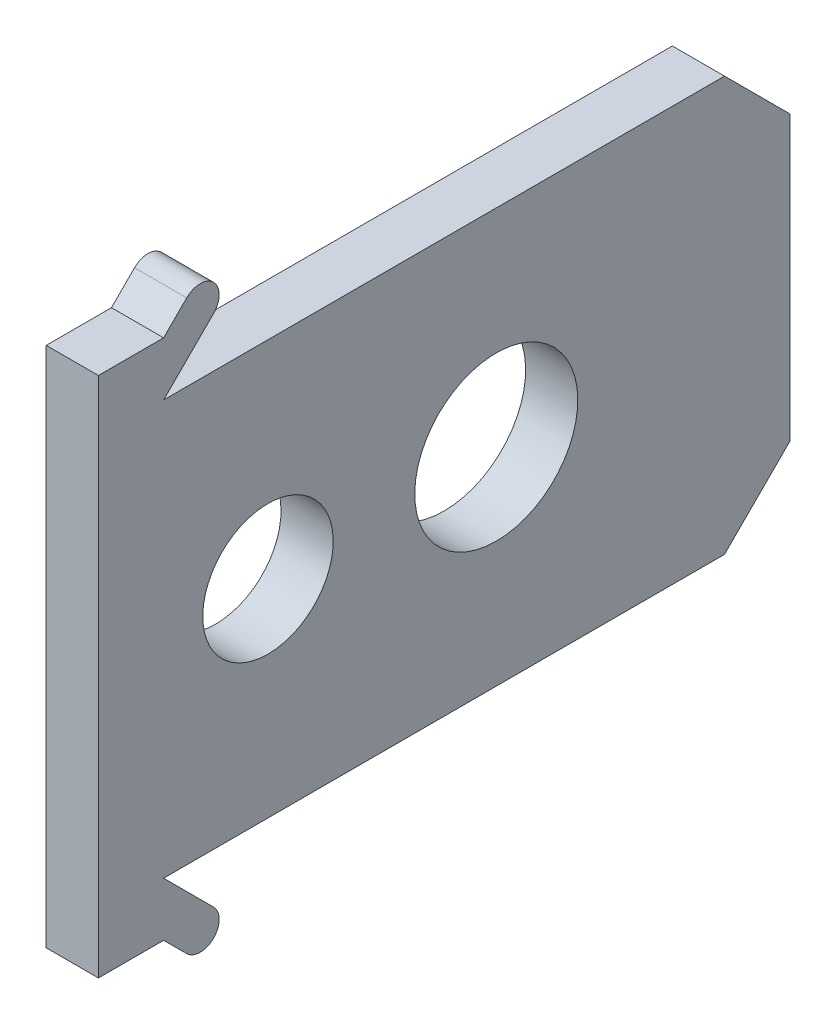
ISO-10303-21;
HEADER;
FILE_DESCRIPTION(('STEP AP214'),'2;1');
FILE_NAME('part.step','',(''),(''),'','','');
FILE_SCHEMA(('AUTOMOTIVE_DESIGN { 1 0 10303 214 1 1 1 1 }'));
ENDSEC;
DATA;
#1=APPLICATION_CONTEXT('core data for automotive mechanical design processes');
#2=APPLICATION_PROTOCOL_DEFINITION('international standard','automotive_design',2000,#1);
#3=PRODUCT_CONTEXT('',#1,'mechanical');
#4=PRODUCT('Part','Part','',(#3));
#5=PRODUCT_RELATED_PRODUCT_CATEGORY('part','',(#4));
#6=PRODUCT_DEFINITION_FORMATION('','',#4);
#7=PRODUCT_DEFINITION_CONTEXT('part definition',#1,'design');
#8=PRODUCT_DEFINITION('design','',#6,#7);
#9=PRODUCT_DEFINITION_SHAPE('','',#8);
#10=(LENGTH_UNIT() NAMED_UNIT(*) SI_UNIT(.MILLI.,.METRE.));
#11=(NAMED_UNIT(*) PLANE_ANGLE_UNIT() SI_UNIT($,.RADIAN.));
#12=(NAMED_UNIT(*) SI_UNIT($,.STERADIAN.) SOLID_ANGLE_UNIT());
#13=UNCERTAINTY_MEASURE_WITH_UNIT(LENGTH_MEASURE(1.E-05),#10,'distance_accuracy_value','');
#14=(GEOMETRIC_REPRESENTATION_CONTEXT(3) GLOBAL_UNCERTAINTY_ASSIGNED_CONTEXT((#13)) GLOBAL_UNIT_ASSIGNED_CONTEXT((#10,
#11,#12)) REPRESENTATION_CONTEXT('',''));
#15=CARTESIAN_POINT('',(0.,0.,0.));
#16=DIRECTION('',(0.,0.,1.));
#17=DIRECTION('',(1.,0.,0.));
#18=AXIS2_PLACEMENT_3D('',#15,#16,#17);
#19=CARTESIAN_POINT('',(0.,0.,-5.1));
#20=DIRECTION('',(1.,0.,0.));
#21=DIRECTION('',(0.,-1.,0.));
#22=AXIS2_PLACEMENT_3D('',#19,#20,#21);
#23=CYLINDRICAL_SURFACE('',#22,1.25);
#24=CARTESIAN_POINT('',(-0.40000000001,0.,-5.10000000001));
#25=DIRECTION('',(1.,0.,0.));
#26=DIRECTION('',(0.,-1.,0.));
#27=AXIS2_PLACEMENT_3D('',#24,#25,#26);
#28=CIRCLE('',#27,1.25000000001);
#29=CARTESIAN_POINT('',(-0.40000000001,-1.25000000001,-5.10000000001));
#30=VERTEX_POINT('',#29);
#31=EDGE_CURVE('E11',#30,#30,#28,.T.);
#32=ORIENTED_EDGE('',*,*,#31,.F.);
#33=EDGE_LOOP('',(#32));
#34=FACE_BOUND('',#33,.T.);
#35=CARTESIAN_POINT('',(0.40000000001,0.,-5.10000000001));
#36=DIRECTION('',(-1.,0.,0.));
#37=DIRECTION('',(0.,-1.,0.));
#38=AXIS2_PLACEMENT_3D('',#35,#36,#37);
#39=CIRCLE('',#38,1.25000000001);
#40=CARTESIAN_POINT('',(0.40000000001,-1.25000000001,-5.10000000001));
#41=VERTEX_POINT('',#40);
#42=EDGE_CURVE('E268',#41,#41,#39,.T.);
#43=ORIENTED_EDGE('',*,*,#42,.F.);
#44=EDGE_LOOP('',(#43));
#45=FACE_BOUND('',#44,.T.);
#46=ADVANCED_FACE('F17',(#34,#45),#23,.F.);
#47=CARTESIAN_POINT('',(0.,0.,-1.6));
#48=DIRECTION('',(1.,0.,0.));
#49=DIRECTION('',(0.,-1.,0.));
#50=AXIS2_PLACEMENT_3D('',#47,#48,#49);
#51=CYLINDRICAL_SURFACE('',#50,1.);
#52=CARTESIAN_POINT('',(-0.40000000001,1.E-11,-1.60000000001));
#53=DIRECTION('',(1.,0.,0.));
#54=DIRECTION('',(0.,-1.,0.));
#55=AXIS2_PLACEMENT_3D('',#52,#53,#54);
#56=CIRCLE('',#55,1.00000000001);
#57=CARTESIAN_POINT('',(-0.40000000001,-1.,-1.60000000001));
#58=VERTEX_POINT('',#57);
#59=EDGE_CURVE('E28',#58,#58,#56,.T.);
#60=ORIENTED_EDGE('',*,*,#59,.F.);
#61=EDGE_LOOP('',(#60));
#62=FACE_BOUND('',#61,.T.);
#63=CARTESIAN_POINT('',(0.40000000001,1.E-11,-1.60000000001));
#64=DIRECTION('',(-1.,0.,0.));
#65=DIRECTION('',(0.,-1.,0.));
#66=AXIS2_PLACEMENT_3D('',#63,#64,#65);
#67=CIRCLE('',#66,1.00000000001);
#68=CARTESIAN_POINT('',(0.40000000001,-1.,-1.60000000001));
#69=VERTEX_POINT('',#68);
#70=EDGE_CURVE('E272',#69,#69,#67,.T.);
#71=ORIENTED_EDGE('',*,*,#70,.F.);
#72=EDGE_LOOP('',(#71));
#73=FACE_BOUND('',#72,.T.);
#74=ADVANCED_FACE('F614',(#62,#73),#51,.F.);
#75=CARTESIAN_POINT('',(-0.4,0.,-3.42091576003781));
#76=DIRECTION('',(1.,0.,0.));
#77=DIRECTION('',(0.,1.,0.));
#78=AXIS2_PLACEMENT_3D('',#75,#76,#77);
#79=PLANE('',#78);
#80=DIRECTION('',(0.,0.,-1.));
#81=VECTOR('',#80,1.);
#82=CARTESIAN_POINT('',(-0.40000000001,-4.00000000001,1.00000000001));
#83=LINE('',#82,#81);
#84=CARTESIAN_POINT('',(-0.4,-4.,1.));
#85=VERTEX_POINT('',#84);
#86=CARTESIAN_POINT('',(-0.4,-4.,0.));
#87=VERTEX_POINT('',#86);
#88=EDGE_CURVE('E244',#85,#87,#83,.T.);
#89=ORIENTED_EDGE('',*,*,#88,.F.);
#90=DIRECTION('',(0.,-1.,0.));
#91=VECTOR('',#90,1.);
#92=CARTESIAN_POINT('',(-0.40000000001,4.00000000001,1.00000000001));
#93=LINE('',#92,#91);
#94=CARTESIAN_POINT('',(-0.4,4.,1.));
#95=VERTEX_POINT('',#94);
#96=EDGE_CURVE('E43',#95,#85,#93,.T.);
#97=ORIENTED_EDGE('',*,*,#96,.F.);
#98=DIRECTION('',(0.,0.,1.));
#99=VECTOR('',#98,1.);
#100=CARTESIAN_POINT('',(-0.40000000001,4.00000000001,0.));
#101=LINE('',#100,#99);
#102=CARTESIAN_POINT('',(-0.4,4.,0.));
#103=VERTEX_POINT('',#102);
#104=EDGE_CURVE('E253',#103,#95,#101,.T.);
#105=ORIENTED_EDGE('',*,*,#104,.F.);
#106=DIRECTION('',(0.,-0.707106781186546,0.70710678118655));
#107=VECTOR('',#106,1.);
#108=CARTESIAN_POINT('',(-0.40000000001,4.35355339060327,-0.353553390603275));
#109=LINE('',#108,#107);
#110=CARTESIAN_POINT('',(-0.4,4.35355339059327,-0.353553390593275));
#111=VERTEX_POINT('',#110);
#112=EDGE_CURVE('E285',#111,#103,#109,.T.);
#113=ORIENTED_EDGE('',*,*,#112,.F.);
#114=CARTESIAN_POINT('',(-0.40000000001,4.14730339060327,-0.559803390603273));
#115=DIRECTION('',(1.,0.,0.));
#116=DIRECTION('',(0.,0.707106781186547,0.707106781186548));
#117=AXIS2_PLACEMENT_3D('',#114,#115,#116);
#118=CIRCLE('',#117,0.291681547253593);
#119=CARTESIAN_POINT('',(-0.4,3.94105339059327,-0.766053390593274));
#120=VERTEX_POINT('',#119);
#121=EDGE_CURVE('E116',#120,#111,#118,.T.);
#122=ORIENTED_EDGE('',*,*,#121,.F.);
#123=DIRECTION('',(0.,0.707106781186547,-0.707106781186548));
#124=VECTOR('',#123,1.);
#125=CARTESIAN_POINT('',(-0.40000000001,3.17500000001,-1.0001665335E-11));
#126=LINE('',#125,#124);
#127=CARTESIAN_POINT('',(-0.4,3.175,0.));
#128=VERTEX_POINT('',#127);
#129=EDGE_CURVE('E129',#128,#120,#126,.T.);
#130=ORIENTED_EDGE('',*,*,#129,.F.);
#131=DIRECTION('',(0.,0.,1.));
#132=VECTOR('',#131,1.);
#133=CARTESIAN_POINT('',(-0.40000000001,3.17500000001,-8.60000000001));
#134=LINE('',#133,#132);
#135=CARTESIAN_POINT('',(-0.4,3.175,-8.6));
#136=VERTEX_POINT('',#135);
#137=EDGE_CURVE('E207',#136,#128,#134,.T.);
#138=ORIENTED_EDGE('',*,*,#137,.F.);
#139=DIRECTION('',(0.,0.707106781186548,0.707106781186548));
#140=VECTOR('',#139,1.);
#141=CARTESIAN_POINT('',(-0.40000000001,2.17500000001,-9.60000000001));
#142=LINE('',#141,#140);
#143=CARTESIAN_POINT('',(-0.4,2.175,-9.6));
#144=VERTEX_POINT('',#143);
#145=EDGE_CURVE('E201',#144,#136,#142,.T.);
#146=ORIENTED_EDGE('',*,*,#145,.F.);
#147=DIRECTION('',(0.,1.,0.));
#148=VECTOR('',#147,1.);
#149=CARTESIAN_POINT('',(-0.40000000001,-2.17500000001,-9.60000000001));
#150=LINE('',#149,#148);
#151=CARTESIAN_POINT('',(-0.4,-2.175,-9.6));
#152=VERTEX_POINT('',#151);
#153=EDGE_CURVE('E198',#152,#144,#150,.T.);
#154=ORIENTED_EDGE('',*,*,#153,.F.);
#155=DIRECTION('',(0.,0.707106781186547,-0.707106781186548));
#156=VECTOR('',#155,1.);
#157=CARTESIAN_POINT('',(-0.40000000001,-3.17500000001,-8.60000000001));
#158=LINE('',#157,#156);
#159=CARTESIAN_POINT('',(-0.4,-3.175,-8.6));
#160=VERTEX_POINT('',#159);
#161=EDGE_CURVE('E158',#160,#152,#158,.T.);
#162=ORIENTED_EDGE('',*,*,#161,.F.);
#163=DIRECTION('',(0.,0.,-1.));
#164=VECTOR('',#163,1.);
#165=CARTESIAN_POINT('',(-0.40000000001,-3.17500000001,-1.0001387779E-11));
#166=LINE('',#165,#164);
#167=CARTESIAN_POINT('',(-0.4,-3.175,0.));
#168=VERTEX_POINT('',#167);
#169=EDGE_CURVE('E168',#168,#160,#166,.T.);
#170=ORIENTED_EDGE('',*,*,#169,.F.);
#171=DIRECTION('',(0.,0.707106781186548,0.707106781186548));
#172=VECTOR('',#171,1.);
#173=CARTESIAN_POINT('',(-0.40000000001,-3.94105339060328,-0.766053390603274));
#174=LINE('',#173,#172);
#175=CARTESIAN_POINT('',(-0.4,-3.94105339059328,-0.766053390593274));
#176=VERTEX_POINT('',#175);
#177=EDGE_CURVE('E234',#176,#168,#174,.T.);
#178=ORIENTED_EDGE('',*,*,#177,.F.);
#179=CARTESIAN_POINT('',(-0.40000000001,-4.14730339060328,-0.559803390603274));
#180=DIRECTION('',(1.,0.,0.));
#181=DIRECTION('',(0.,0.707106781186548,-0.707106781186547));
#182=AXIS2_PLACEMENT_3D('',#179,#180,#181);
#183=CIRCLE('',#182,0.291681547253593);
#184=CARTESIAN_POINT('',(-0.4,-4.35355339059327,-0.353553390593275));
#185=VERTEX_POINT('',#184);
#186=EDGE_CURVE('E267',#185,#176,#183,.T.);
#187=ORIENTED_EDGE('',*,*,#186,.F.);
#188=DIRECTION('',(0.,-0.707106781186546,-0.707106781186549));
#189=VECTOR('',#188,1.);
#190=CARTESIAN_POINT('',(-0.40000000001,-4.00000000001,-1.00004601036E-11));
#191=LINE('',#190,#189);
#192=EDGE_CURVE('E236',#87,#185,#191,.T.);
#193=ORIENTED_EDGE('',*,*,#192,.F.);
#194=EDGE_LOOP('',(#89,#97,#105,#113,#122,#130,#138,#146,#154,#162,#170,#178,#187,#193));
#195=FACE_BOUND('',#194,.T.);
#196=ORIENTED_EDGE('',*,*,#31,.T.);
#197=EDGE_LOOP('',(#196));
#198=FACE_BOUND('',#197,.T.);
#199=ORIENTED_EDGE('',*,*,#59,.T.);
#200=EDGE_LOOP('',(#199));
#201=FACE_BOUND('',#200,.T.);
#202=ADVANCED_FACE('F337',(#195,#198,#201),#79,.F.);
#203=CARTESIAN_POINT('',(0.,4.,1.));
#204=DIRECTION('',(0.,1.,0.));
#205=DIRECTION('',(1.,0.,0.));
#206=AXIS2_PLACEMENT_3D('',#203,#204,#205);
#207=PLANE('',#206);
#208=DIRECTION('',(0.,0.,-1.));
#209=VECTOR('',#208,1.);
#210=CARTESIAN_POINT('',(0.40000000001,4.00000000001,1.00000000001));
#211=LINE('',#210,#209);
#212=CARTESIAN_POINT('',(0.4,4.,1.));
#213=VERTEX_POINT('',#212);
#214=CARTESIAN_POINT('',(0.4,4.,0.));
#215=VERTEX_POINT('',#214);
#216=EDGE_CURVE('E247',#213,#215,#211,.T.);
#217=ORIENTED_EDGE('',*,*,#216,.T.);
#218=DIRECTION('',(-1.,0.,0.));
#219=VECTOR('',#218,1.);
#220=CARTESIAN_POINT('',(0.40000000001,4.00000000001,0.));
#221=LINE('',#220,#219);
#222=EDGE_CURVE('E249',#215,#103,#221,.T.);
#223=ORIENTED_EDGE('',*,*,#222,.T.);
#224=ORIENTED_EDGE('',*,*,#104,.T.);
#225=DIRECTION('',(-1.,0.,0.));
#226=VECTOR('',#225,1.);
#227=CARTESIAN_POINT('',(0.40000000001,4.00000000001,1.00000000001));
#228=LINE('',#227,#226);
#229=EDGE_CURVE('E258',#213,#95,#228,.T.);
#230=ORIENTED_EDGE('',*,*,#229,.F.);
#231=EDGE_LOOP('',(#217,#223,#224,#230));
#232=FACE_BOUND('',#231,.T.);
#233=ADVANCED_FACE('F398',(#232),#207,.T.);
#234=CARTESIAN_POINT('',(0.,4.,0.));
#235=DIRECTION('',(0.,0.707106781186549,0.707106781186546));
#236=DIRECTION('',(1.,0.,0.));
#237=AXIS2_PLACEMENT_3D('',#234,#235,#236);
#238=PLANE('',#237);
#239=DIRECTION('',(0.,0.707106781186546,-0.70710678118655));
#240=VECTOR('',#239,1.);
#241=CARTESIAN_POINT('',(0.40000000001,4.00000000001,0.));
#242=LINE('',#241,#240);
#243=CARTESIAN_POINT('',(0.4,4.35355339059327,-0.353553390593275));
#244=VERTEX_POINT('',#243);
#245=EDGE_CURVE('E279',#215,#244,#242,.T.);
#246=ORIENTED_EDGE('',*,*,#245,.T.);
#247=DIRECTION('',(-1.,0.,0.));
#248=VECTOR('',#247,1.);
#249=CARTESIAN_POINT('',(0.40000000001,4.35355339060327,-0.353553390603275));
#250=LINE('',#249,#248);
#251=EDGE_CURVE('E281',#244,#111,#250,.T.);
#252=ORIENTED_EDGE('',*,*,#251,.T.);
#253=ORIENTED_EDGE('',*,*,#112,.T.);
#254=ORIENTED_EDGE('',*,*,#222,.F.);
#255=EDGE_LOOP('',(#246,#252,#253,#254));
#256=FACE_BOUND('',#255,.T.);
#257=ADVANCED_FACE('F403',(#256),#238,.T.);
#258=CARTESIAN_POINT('',(0.,4.14730339059327,-0.559803390593273));
#259=DIRECTION('',(1.,0.,0.));
#260=DIRECTION('',(0.,0.707106781186547,0.707106781186548));
#261=AXIS2_PLACEMENT_3D('',#258,#259,#260);
#262=CYLINDRICAL_SURFACE('',#261,0.291681547239451);
#263=CARTESIAN_POINT('',(0.40000000001,4.14730339060327,-0.559803390603273));
#264=DIRECTION('',(-1.,0.,0.));
#265=DIRECTION('',(0.,0.707106781186547,0.707106781186548));
#266=AXIS2_PLACEMENT_3D('',#263,#264,#265);
#267=CIRCLE('',#266,0.291681547253593);
#268=CARTESIAN_POINT('',(0.4,3.94105339059327,-0.766053390593274));
#269=VERTEX_POINT('',#268);
#270=EDGE_CURVE('E289',#244,#269,#267,.T.);
#271=ORIENTED_EDGE('',*,*,#270,.T.);
#272=DIRECTION('',(-1.,0.,0.));
#273=VECTOR('',#272,1.);
#274=CARTESIAN_POINT('',(0.40000000001,3.94105339060327,-0.766053390603274));
#275=LINE('',#274,#273);
#276=EDGE_CURVE('E286',#269,#120,#275,.T.);
#277=ORIENTED_EDGE('',*,*,#276,.T.);
#278=ORIENTED_EDGE('',*,*,#121,.T.);
#279=ORIENTED_EDGE('',*,*,#251,.F.);
#280=EDGE_LOOP('',(#271,#277,#278,#279));
#281=FACE_BOUND('',#280,.T.);
#282=ADVANCED_FACE('F357',(#281),#262,.T.);
#283=CARTESIAN_POINT('',(0.,3.94105339059327,-0.766053390593274));
#284=DIRECTION('',(0.,-0.707106781186547,-0.707106781186548));
#285=DIRECTION('',(0.,-0.707106781186548,0.707106781186547));
#286=AXIS2_PLACEMENT_3D('',#283,#284,#285);
#287=PLANE('',#286);
#288=DIRECTION('',(0.,-0.707106781186547,0.707106781186548));
#289=VECTOR('',#288,1.);
#290=CARTESIAN_POINT('',(0.40000000001,3.94105339060327,-0.766053390603274));
#291=LINE('',#290,#289);
#292=CARTESIAN_POINT('',(0.4,3.175,0.));
#293=VERTEX_POINT('',#292);
#294=EDGE_CURVE('E313',#269,#293,#291,.T.);
#295=ORIENTED_EDGE('',*,*,#294,.T.);
#296=DIRECTION('',(-1.,0.,0.));
#297=VECTOR('',#296,1.);
#298=CARTESIAN_POINT('',(0.40000000001,3.17500000001,-1.0001665335E-11));
#299=LINE('',#298,#297);
#300=EDGE_CURVE('E260',#293,#128,#299,.T.);
#301=ORIENTED_EDGE('',*,*,#300,.T.);
#302=ORIENTED_EDGE('',*,*,#129,.T.);
#303=ORIENTED_EDGE('',*,*,#276,.F.);
#304=EDGE_LOOP('',(#295,#301,#302,#303));
#305=FACE_BOUND('',#304,.T.);
#306=ADVANCED_FACE('F339',(#305),#287,.T.);
#307=CARTESIAN_POINT('',(0.,3.175,0.));
#308=DIRECTION('',(0.,1.,0.));
#309=DIRECTION('',(1.,0.,0.));
#310=AXIS2_PLACEMENT_3D('',#307,#308,#309);
#311=PLANE('',#310);
#312=DIRECTION('',(0.,0.,-1.));
#313=VECTOR('',#312,1.);
#314=CARTESIAN_POINT('',(0.40000000001,3.17500000001,-1.0001665335E-11));
#315=LINE('',#314,#313);
#316=CARTESIAN_POINT('',(0.4,3.175,-8.6));
#317=VERTEX_POINT('',#316);
#318=EDGE_CURVE('E261',#293,#317,#315,.T.);
#319=ORIENTED_EDGE('',*,*,#318,.T.);
#320=DIRECTION('',(-1.,0.,0.));
#321=VECTOR('',#320,1.);
#322=CARTESIAN_POINT('',(0.40000000001,3.17500000001,-8.60000000001));
#323=LINE('',#322,#321);
#324=EDGE_CURVE('E181',#317,#136,#323,.T.);
#325=ORIENTED_EDGE('',*,*,#324,.T.);
#326=ORIENTED_EDGE('',*,*,#137,.T.);
#327=ORIENTED_EDGE('',*,*,#300,.F.);
#328=EDGE_LOOP('',(#319,#325,#326,#327));
#329=FACE_BOUND('',#328,.T.);
#330=ADVANCED_FACE('F335',(#329),#311,.T.);
#331=CARTESIAN_POINT('',(0.,3.175,-8.6));
#332=DIRECTION('',(0.,0.707106781186547,-0.707106781186548));
#333=DIRECTION('',(-1.,0.,0.));
#334=AXIS2_PLACEMENT_3D('',#331,#332,#333);
#335=PLANE('',#334);
#336=DIRECTION('',(0.,-0.707106781186548,-0.707106781186548));
#337=VECTOR('',#336,1.);
#338=CARTESIAN_POINT('',(0.40000000001,3.17500000001,-8.60000000001));
#339=LINE('',#338,#337);
#340=CARTESIAN_POINT('',(0.4,2.175,-9.6));
#341=VERTEX_POINT('',#340);
#342=EDGE_CURVE('E200',#317,#341,#339,.T.);
#343=ORIENTED_EDGE('',*,*,#342,.T.);
#344=DIRECTION('',(-1.,0.,0.));
#345=VECTOR('',#344,1.);
#346=CARTESIAN_POINT('',(0.40000000001,2.17500000001,-9.60000000001));
#347=LINE('',#346,#345);
#348=EDGE_CURVE('E192',#341,#144,#347,.T.);
#349=ORIENTED_EDGE('',*,*,#348,.T.);
#350=ORIENTED_EDGE('',*,*,#145,.T.);
#351=ORIENTED_EDGE('',*,*,#324,.F.);
#352=EDGE_LOOP('',(#343,#349,#350,#351));
#353=FACE_BOUND('',#352,.T.);
#354=ADVANCED_FACE('F204',(#353),#335,.T.);
#355=CARTESIAN_POINT('',(0.,2.175,-9.6));
#356=DIRECTION('',(0.,0.,-1.));
#357=DIRECTION('',(0.,-1.,0.));
#358=AXIS2_PLACEMENT_3D('',#355,#356,#357);
#359=PLANE('',#358);
#360=DIRECTION('',(0.,-1.,0.));
#361=VECTOR('',#360,1.);
#362=CARTESIAN_POINT('',(0.40000000001,2.17500000001,-9.60000000001));
#363=LINE('',#362,#361);
#364=CARTESIAN_POINT('',(0.4,-2.175,-9.6));
#365=VERTEX_POINT('',#364);
#366=EDGE_CURVE('E196',#341,#365,#363,.T.);
#367=ORIENTED_EDGE('',*,*,#366,.T.);
#368=DIRECTION('',(-1.,0.,0.));
#369=VECTOR('',#368,1.);
#370=CARTESIAN_POINT('',(0.40000000001,-2.17500000001,-9.60000000001));
#371=LINE('',#370,#369);
#372=EDGE_CURVE('E216',#365,#152,#371,.T.);
#373=ORIENTED_EDGE('',*,*,#372,.T.);
#374=ORIENTED_EDGE('',*,*,#153,.T.);
#375=ORIENTED_EDGE('',*,*,#348,.F.);
#376=EDGE_LOOP('',(#367,#373,#374,#375));
#377=FACE_BOUND('',#376,.T.);
#378=ADVANCED_FACE('F193',(#377),#359,.T.);
#379=CARTESIAN_POINT('',(0.,-2.175,-9.6));
#380=DIRECTION('',(0.,-0.707106781186548,-0.707106781186547));
#381=DIRECTION('',(0.,0.707106781186547,-0.707106781186548));
#382=AXIS2_PLACEMENT_3D('',#379,#380,#381);
#383=PLANE('',#382);
#384=DIRECTION('',(0.,-0.707106781186547,0.707106781186548));
#385=VECTOR('',#384,1.);
#386=CARTESIAN_POINT('',(0.40000000001,-2.17500000001,-9.60000000001));
#387=LINE('',#386,#385);
#388=CARTESIAN_POINT('',(0.4,-3.175,-8.6));
#389=VERTEX_POINT('',#388);
#390=EDGE_CURVE('E214',#365,#389,#387,.T.);
#391=ORIENTED_EDGE('',*,*,#390,.T.);
#392=DIRECTION('',(-1.,0.,0.));
#393=VECTOR('',#392,1.);
#394=CARTESIAN_POINT('',(0.40000000001,-3.17500000001,-8.60000000001));
#395=LINE('',#394,#393);
#396=EDGE_CURVE('E228',#389,#160,#395,.T.);
#397=ORIENTED_EDGE('',*,*,#396,.T.);
#398=ORIENTED_EDGE('',*,*,#161,.T.);
#399=ORIENTED_EDGE('',*,*,#372,.F.);
#400=EDGE_LOOP('',(#391,#397,#398,#399));
#401=FACE_BOUND('',#400,.T.);
#402=ADVANCED_FACE('F500',(#401),#383,.T.);
#403=CARTESIAN_POINT('',(0.,-3.175,-8.6));
#404=DIRECTION('',(0.,-1.,0.));
#405=DIRECTION('',(0.,0.,-1.));
#406=AXIS2_PLACEMENT_3D('',#403,#404,#405);
#407=PLANE('',#406);
#408=DIRECTION('',(0.,0.,1.));
#409=VECTOR('',#408,1.);
#410=CARTESIAN_POINT('',(0.40000000001,-3.17500000001,-8.60000000001));
#411=LINE('',#410,#409);
#412=CARTESIAN_POINT('',(0.4,-3.175,0.));
#413=VERTEX_POINT('',#412);
#414=EDGE_CURVE('E229',#389,#413,#411,.T.);
#415=ORIENTED_EDGE('',*,*,#414,.T.);
#416=DIRECTION('',(-1.,0.,0.));
#417=VECTOR('',#416,1.);
#418=CARTESIAN_POINT('',(0.40000000001,-3.17500000001,-1.0001387779E-11));
#419=LINE('',#418,#417);
#420=EDGE_CURVE('E274',#413,#168,#419,.T.);
#421=ORIENTED_EDGE('',*,*,#420,.T.);
#422=ORIENTED_EDGE('',*,*,#169,.T.);
#423=ORIENTED_EDGE('',*,*,#396,.F.);
#424=EDGE_LOOP('',(#415,#421,#422,#423));
#425=FACE_BOUND('',#424,.T.);
#426=ADVANCED_FACE('F369',(#425),#407,.T.);
#427=CARTESIAN_POINT('',(0.,-3.175,0.));
#428=DIRECTION('',(0.,0.707106781186548,-0.707106781186547));
#429=DIRECTION('',(-1.,0.,0.));
#430=AXIS2_PLACEMENT_3D('',#427,#428,#429);
#431=PLANE('',#430);
#432=DIRECTION('',(0.,-0.707106781186548,-0.707106781186548));
#433=VECTOR('',#432,1.);
#434=CARTESIAN_POINT('',(0.40000000001,-3.17500000001,-1.0001387779E-11));
#435=LINE('',#434,#433);
#436=CARTESIAN_POINT('',(0.4,-3.94105339059328,-0.766053390593274));
#437=VERTEX_POINT('',#436);
#438=EDGE_CURVE('E275',#413,#437,#435,.T.);
#439=ORIENTED_EDGE('',*,*,#438,.T.);
#440=DIRECTION('',(-1.,0.,0.));
#441=VECTOR('',#440,1.);
#442=CARTESIAN_POINT('',(0.40000000001,-3.94105339060328,-0.766053390603274));
#443=LINE('',#442,#441);
#444=EDGE_CURVE('E304',#437,#176,#443,.T.);
#445=ORIENTED_EDGE('',*,*,#444,.T.);
#446=ORIENTED_EDGE('',*,*,#177,.T.);
#447=ORIENTED_EDGE('',*,*,#420,.F.);
#448=EDGE_LOOP('',(#439,#445,#446,#447));
#449=FACE_BOUND('',#448,.T.);
#450=ADVANCED_FACE('F19',(#449),#431,.T.);
#451=CARTESIAN_POINT('',(0.,-4.14730339059328,-0.559803390593274));
#452=DIRECTION('',(1.,0.,0.));
#453=DIRECTION('',(0.,0.707106781186548,-0.707106781186547));
#454=AXIS2_PLACEMENT_3D('',#451,#452,#453);
#455=CYLINDRICAL_SURFACE('',#454,0.291681547239451);
#456=CARTESIAN_POINT('',(0.40000000001,-4.14730339060328,-0.559803390603274));
#457=DIRECTION('',(-1.,0.,0.));
#458=DIRECTION('',(0.,0.707106781186548,-0.707106781186547));
#459=AXIS2_PLACEMENT_3D('',#456,#457,#458);
#460=CIRCLE('',#459,0.291681547253593);
#461=CARTESIAN_POINT('',(0.4,-4.35355339059327,-0.353553390593275));
#462=VERTEX_POINT('',#461);
#463=EDGE_CURVE('E230',#437,#462,#460,.T.);
#464=ORIENTED_EDGE('',*,*,#463,.T.);
#465=DIRECTION('',(-1.,0.,0.));
#466=VECTOR('',#465,1.);
#467=CARTESIAN_POINT('',(0.40000000001,-4.35355339060327,-0.353553390603275));
#468=LINE('',#467,#466);
#469=EDGE_CURVE('E235',#462,#185,#468,.T.);
#470=ORIENTED_EDGE('',*,*,#469,.T.);
#471=ORIENTED_EDGE('',*,*,#186,.T.);
#472=ORIENTED_EDGE('',*,*,#444,.F.);
#473=EDGE_LOOP('',(#464,#470,#471,#472));
#474=FACE_BOUND('',#473,.T.);
#475=ADVANCED_FACE('F375',(#474),#455,.T.);
#476=CARTESIAN_POINT('',(0.,-4.35355339059327,-0.353553390593275));
#477=DIRECTION('',(0.,-0.707106781186549,0.707106781186546));
#478=DIRECTION('',(-1.,0.,0.));
#479=AXIS2_PLACEMENT_3D('',#476,#477,#478);
#480=PLANE('',#479);
#481=DIRECTION('',(0.,0.707106781186546,0.707106781186549));
#482=VECTOR('',#481,1.);
#483=CARTESIAN_POINT('',(0.40000000001,-4.35355339060327,-0.353553390603275));
#484=LINE('',#483,#482);
#485=CARTESIAN_POINT('',(0.4,-4.,0.));
#486=VERTEX_POINT('',#485);
#487=EDGE_CURVE('E263',#462,#486,#484,.T.);
#488=ORIENTED_EDGE('',*,*,#487,.T.);
#489=DIRECTION('',(-1.,0.,0.));
#490=VECTOR('',#489,1.);
#491=CARTESIAN_POINT('',(0.40000000001,-4.00000000001,-1.00004601036E-11));
#492=LINE('',#491,#490);
#493=EDGE_CURVE('E239',#486,#87,#492,.T.);
#494=ORIENTED_EDGE('',*,*,#493,.T.);
#495=ORIENTED_EDGE('',*,*,#192,.T.);
#496=ORIENTED_EDGE('',*,*,#469,.F.);
#497=EDGE_LOOP('',(#488,#494,#495,#496));
#498=FACE_BOUND('',#497,.T.);
#499=ADVANCED_FACE('F540',(#498),#480,.T.);
#500=CARTESIAN_POINT('',(0.,-4.,0.));
#501=DIRECTION('',(0.,-1.,0.));
#502=DIRECTION('',(0.,0.,-1.));
#503=AXIS2_PLACEMENT_3D('',#500,#501,#502);
#504=PLANE('',#503);
#505=DIRECTION('',(0.,0.,1.));
#506=VECTOR('',#505,1.);
#507=CARTESIAN_POINT('',(0.40000000001,-4.00000000001,-1.00004601036E-11));
#508=LINE('',#507,#506);
#509=CARTESIAN_POINT('',(0.4,-4.,1.));
#510=VERTEX_POINT('',#509);
#511=EDGE_CURVE('E240',#486,#510,#508,.T.);
#512=ORIENTED_EDGE('',*,*,#511,.T.);
#513=DIRECTION('',(1.,0.,0.));
#514=VECTOR('',#513,1.);
#515=CARTESIAN_POINT('',(-0.40000000001,-4.00000000001,1.00000000001));
#516=LINE('',#515,#514);
#517=EDGE_CURVE('E21',#85,#510,#516,.T.);
#518=ORIENTED_EDGE('',*,*,#517,.F.);
#519=ORIENTED_EDGE('',*,*,#88,.T.);
#520=ORIENTED_EDGE('',*,*,#493,.F.);
#521=EDGE_LOOP('',(#512,#518,#519,#520));
#522=FACE_BOUND('',#521,.T.);
#523=ADVANCED_FACE('F551',(#522),#504,.T.);
#524=CARTESIAN_POINT('',(0.,-4.,1.));
#525=DIRECTION('',(0.,0.,1.));
#526=DIRECTION('',(1.,0.,0.));
#527=AXIS2_PLACEMENT_3D('',#524,#525,#526);
#528=PLANE('',#527);
#529=DIRECTION('',(0.,1.,0.));
#530=VECTOR('',#529,1.);
#531=CARTESIAN_POINT('',(0.40000000001,-4.00000000001,1.00000000001));
#532=LINE('',#531,#530);
#533=EDGE_CURVE('E254',#510,#213,#532,.T.);
#534=ORIENTED_EDGE('',*,*,#533,.T.);
#535=ORIENTED_EDGE('',*,*,#229,.T.);
#536=ORIENTED_EDGE('',*,*,#96,.T.);
#537=ORIENTED_EDGE('',*,*,#517,.T.);
#538=EDGE_LOOP('',(#534,#535,#536,#537));
#539=FACE_BOUND('',#538,.T.);
#540=ADVANCED_FACE('F563',(#539),#528,.T.);
#541=CARTESIAN_POINT('',(0.4,0.,-3.42091576003781));
#542=DIRECTION('',(1.,0.,0.));
#543=DIRECTION('',(0.,1.,0.));
#544=AXIS2_PLACEMENT_3D('',#541,#542,#543);
#545=PLANE('',#544);
#546=ORIENTED_EDGE('',*,*,#216,.F.);
#547=ORIENTED_EDGE('',*,*,#533,.F.);
#548=ORIENTED_EDGE('',*,*,#511,.F.);
#549=ORIENTED_EDGE('',*,*,#487,.F.);
#550=ORIENTED_EDGE('',*,*,#463,.F.);
#551=ORIENTED_EDGE('',*,*,#438,.F.);
#552=ORIENTED_EDGE('',*,*,#414,.F.);
#553=ORIENTED_EDGE('',*,*,#390,.F.);
#554=ORIENTED_EDGE('',*,*,#366,.F.);
#555=ORIENTED_EDGE('',*,*,#342,.F.);
#556=ORIENTED_EDGE('',*,*,#318,.F.);
#557=ORIENTED_EDGE('',*,*,#294,.F.);
#558=ORIENTED_EDGE('',*,*,#270,.F.);
#559=ORIENTED_EDGE('',*,*,#245,.F.);
#560=EDGE_LOOP('',(#546,#547,#548,#549,#550,#551,#552,#553,#554,#555,#556,#557,#558,#559));
#561=FACE_BOUND('',#560,.T.);
#562=ORIENTED_EDGE('',*,*,#42,.T.);
#563=EDGE_LOOP('',(#562));
#564=FACE_BOUND('',#563,.T.);
#565=ORIENTED_EDGE('',*,*,#70,.T.);
#566=EDGE_LOOP('',(#565));
#567=FACE_BOUND('',#566,.T.);
#568=ADVANCED_FACE('F210',(#561,#564,#567),#545,.T.);
#569=CLOSED_SHELL('',(#46,#74,#202,#233,#257,#282,#306,#330,#354,#378,#402,#426,#450,#475,#499,
#523,#540,#568));
#570=MANIFOLD_SOLID_BREP('B1',#569);
#571=ADVANCED_BREP_SHAPE_REPRESENTATION('',(#18,#570),#14);
#572=SHAPE_DEFINITION_REPRESENTATION(#9,#571);
ENDSEC;
END-ISO-10303-21;
